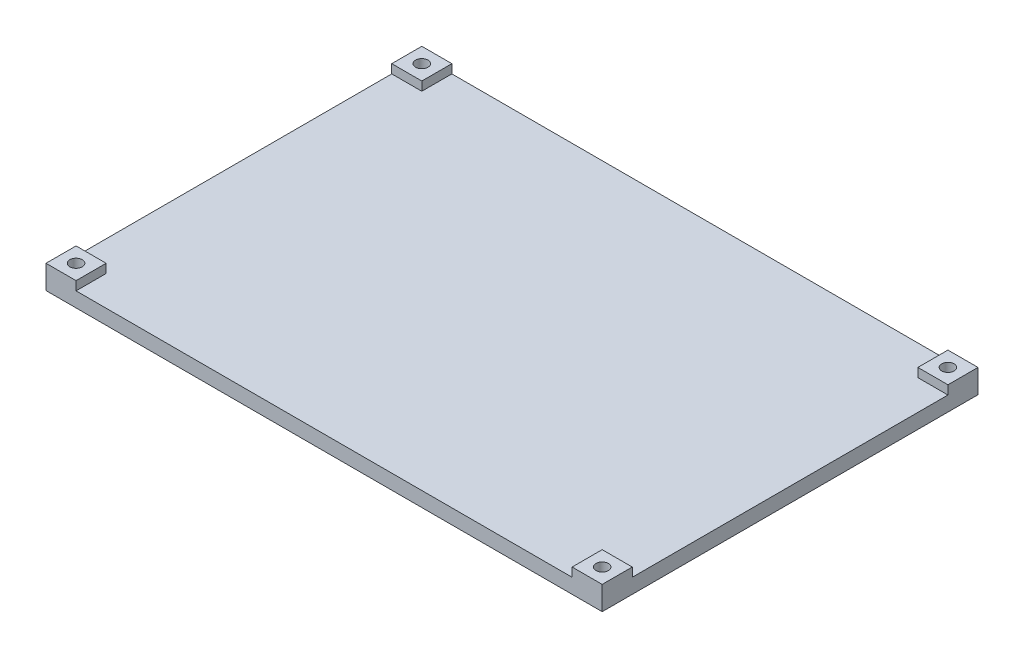
ISO-10303-21;
HEADER;
FILE_DESCRIPTION(('STEP AP214'),'2;1');
FILE_NAME('part.step','',(''),(''),'','','');
FILE_SCHEMA(('AUTOMOTIVE_DESIGN { 1 0 10303 214 1 1 1 1 }'));
ENDSEC;
DATA;
#1=APPLICATION_CONTEXT('core data for automotive mechanical design processes');
#2=APPLICATION_PROTOCOL_DEFINITION('international standard','automotive_design',2000,#1);
#3=PRODUCT_CONTEXT('',#1,'mechanical');
#4=PRODUCT('Part','Part','',(#3));
#5=PRODUCT_RELATED_PRODUCT_CATEGORY('part','',(#4));
#6=PRODUCT_DEFINITION_FORMATION('','',#4);
#7=PRODUCT_DEFINITION_CONTEXT('part definition',#1,'design');
#8=PRODUCT_DEFINITION('design','',#6,#7);
#9=PRODUCT_DEFINITION_SHAPE('','',#8);
#10=(LENGTH_UNIT() NAMED_UNIT(*) SI_UNIT(.MILLI.,.METRE.));
#11=(NAMED_UNIT(*) PLANE_ANGLE_UNIT() SI_UNIT($,.RADIAN.));
#12=(NAMED_UNIT(*) SI_UNIT($,.STERADIAN.) SOLID_ANGLE_UNIT());
#13=UNCERTAINTY_MEASURE_WITH_UNIT(LENGTH_MEASURE(1.E-05),#10,'distance_accuracy_value','');
#14=(GEOMETRIC_REPRESENTATION_CONTEXT(3) GLOBAL_UNCERTAINTY_ASSIGNED_CONTEXT((#13)) GLOBAL_UNIT_ASSIGNED_CONTEXT((#10,
#11,#12)) REPRESENTATION_CONTEXT('',''));
#15=CARTESIAN_POINT('',(0.,0.,0.));
#16=DIRECTION('',(0.,0.,1.));
#17=DIRECTION('',(1.,0.,0.));
#18=AXIS2_PLACEMENT_3D('',#15,#16,#17);
#19=CARTESIAN_POINT('',(0.,4.,0.));
#20=DIRECTION('',(0.,-1.,0.));
#21=DIRECTION('',(0.,0.,-1.));
#22=AXIS2_PLACEMENT_3D('',#19,#20,#21);
#23=PLANE('',#22);
#24=CARTESIAN_POINT('',(-44.45,4.,-29.21));
#25=DIRECTION('',(0.,1.,0.));
#26=DIRECTION('',(0.,0.,1.));
#27=AXIS2_PLACEMENT_3D('',#24,#25,#26);
#28=CIRCLE('',#27,1.05);
#29=CARTESIAN_POINT('',(-44.45,4.,-28.16));
#30=VERTEX_POINT('',#29);
#31=EDGE_CURVE('E332',#30,#30,#28,.T.);
#32=ORIENTED_EDGE('',*,*,#31,.F.);
#33=EDGE_LOOP('',(#32));
#34=FACE_BOUND('',#33,.T.);
#35=DIRECTION('',(0.,0.,-1.));
#36=VECTOR('',#35,1.);
#37=CARTESIAN_POINT('',(-41.91,4.,-31.75));
#38=LINE('',#37,#36);
#39=CARTESIAN_POINT('',(-41.91,4.,-26.67));
#40=VERTEX_POINT('',#39);
#41=CARTESIAN_POINT('',(-41.91,4.,-31.75));
#42=VERTEX_POINT('',#41);
#43=EDGE_CURVE('E294',#40,#42,#38,.T.);
#44=ORIENTED_EDGE('',*,*,#43,.T.);
#45=DIRECTION('',(1.,0.,0.));
#46=VECTOR('',#45,1.);
#47=CARTESIAN_POINT('',(-46.99,4.,-31.75));
#48=LINE('',#47,#46);
#49=CARTESIAN_POINT('',(-46.99,4.,-31.75));
#50=VERTEX_POINT('',#49);
#51=EDGE_CURVE('E341',#50,#42,#48,.T.);
#52=ORIENTED_EDGE('',*,*,#51,.F.);
#53=DIRECTION('',(0.,0.,-1.));
#54=VECTOR('',#53,1.);
#55=CARTESIAN_POINT('',(-46.99,4.,31.75));
#56=LINE('',#55,#54);
#57=CARTESIAN_POINT('',(-46.99,4.,-26.67));
#58=VERTEX_POINT('',#57);
#59=EDGE_CURVE('E148',#58,#50,#56,.T.);
#60=ORIENTED_EDGE('',*,*,#59,.F.);
#61=DIRECTION('',(1.,0.,0.));
#62=VECTOR('',#61,1.);
#63=CARTESIAN_POINT('',(-46.99,4.,-26.67));
#64=LINE('',#63,#62);
#65=EDGE_CURVE('E285',#58,#40,#64,.T.);
#66=ORIENTED_EDGE('',*,*,#65,.T.);
#67=EDGE_LOOP('',(#44,#52,#60,#66));
#68=FACE_BOUND('',#67,.T.);
#69=ADVANCED_FACE('F100',(#34,#68),#23,.F.);
#70=CARTESIAN_POINT('',(-44.45,4.,29.21));
#71=DIRECTION('',(0.,1.,0.));
#72=DIRECTION('',(0.,0.,1.));
#73=AXIS2_PLACEMENT_3D('',#70,#71,#72);
#74=CIRCLE('',#73,1.05);
#75=CARTESIAN_POINT('',(-44.45,4.,30.26));
#76=VERTEX_POINT('',#75);
#77=EDGE_CURVE('E314',#76,#76,#74,.T.);
#78=ORIENTED_EDGE('',*,*,#77,.F.);
#79=EDGE_LOOP('',(#78));
#80=FACE_BOUND('',#79,.T.);
#81=DIRECTION('',(-1.,0.,0.));
#82=VECTOR('',#81,1.);
#83=CARTESIAN_POINT('',(-46.99,4.,26.67));
#84=LINE('',#83,#82);
#85=CARTESIAN_POINT('',(-41.91,4.,26.67));
#86=VERTEX_POINT('',#85);
#87=CARTESIAN_POINT('',(-46.99,4.,26.67));
#88=VERTEX_POINT('',#87);
#89=EDGE_CURVE('E275',#86,#88,#84,.T.);
#90=ORIENTED_EDGE('',*,*,#89,.T.);
#91=CARTESIAN_POINT('',(-46.99,4.,31.75));
#92=VERTEX_POINT('',#91);
#93=EDGE_CURVE('E338',#92,#88,#56,.T.);
#94=ORIENTED_EDGE('',*,*,#93,.F.);
#95=DIRECTION('',(1.,0.,0.));
#96=VECTOR('',#95,1.);
#97=CARTESIAN_POINT('',(-46.99,4.,31.75));
#98=LINE('',#97,#96);
#99=CARTESIAN_POINT('',(-41.91,4.,31.75));
#100=VERTEX_POINT('',#99);
#101=EDGE_CURVE('E349',#92,#100,#98,.T.);
#102=ORIENTED_EDGE('',*,*,#101,.T.);
#103=DIRECTION('',(0.,0.,-1.));
#104=VECTOR('',#103,1.);
#105=CARTESIAN_POINT('',(-41.91,4.,26.67));
#106=LINE('',#105,#104);
#107=EDGE_CURVE('E266',#100,#86,#106,.T.);
#108=ORIENTED_EDGE('',*,*,#107,.T.);
#109=EDGE_LOOP('',(#90,#94,#102,#108));
#110=FACE_BOUND('',#109,.T.);
#111=ADVANCED_FACE('F396',(#80,#110),#23,.F.);
#112=CARTESIAN_POINT('',(44.45,4.,29.21));
#113=DIRECTION('',(0.,1.,0.));
#114=DIRECTION('',(0.,0.,1.));
#115=AXIS2_PLACEMENT_3D('',#112,#113,#114);
#116=CIRCLE('',#115,1.05);
#117=CARTESIAN_POINT('',(44.45,4.,30.26));
#118=VERTEX_POINT('',#117);
#119=EDGE_CURVE('E320',#118,#118,#116,.T.);
#120=ORIENTED_EDGE('',*,*,#119,.F.);
#121=EDGE_LOOP('',(#120));
#122=FACE_BOUND('',#121,.T.);
#123=DIRECTION('',(0.,0.,1.));
#124=VECTOR('',#123,1.);
#125=CARTESIAN_POINT('',(41.91,4.,31.75));
#126=LINE('',#125,#124);
#127=CARTESIAN_POINT('',(41.91,4.,26.67));
#128=VERTEX_POINT('',#127);
#129=CARTESIAN_POINT('',(41.91,4.,31.75));
#130=VERTEX_POINT('',#129);
#131=EDGE_CURVE('E256',#128,#130,#126,.T.);
#132=ORIENTED_EDGE('',*,*,#131,.T.);
#133=CARTESIAN_POINT('',(46.99,4.,31.75));
#134=VERTEX_POINT('',#133);
#135=EDGE_CURVE('E348',#130,#134,#98,.T.);
#136=ORIENTED_EDGE('',*,*,#135,.T.);
#137=DIRECTION('',(0.,0.,-1.));
#138=VECTOR('',#137,1.);
#139=CARTESIAN_POINT('',(46.99,4.,31.75));
#140=LINE('',#139,#138);
#141=CARTESIAN_POINT('',(46.99,4.,26.67));
#142=VERTEX_POINT('',#141);
#143=EDGE_CURVE('E345',#134,#142,#140,.T.);
#144=ORIENTED_EDGE('',*,*,#143,.T.);
#145=DIRECTION('',(-1.,0.,0.));
#146=VECTOR('',#145,1.);
#147=CARTESIAN_POINT('',(46.99,4.,26.67));
#148=LINE('',#147,#146);
#149=EDGE_CURVE('E249',#142,#128,#148,.T.);
#150=ORIENTED_EDGE('',*,*,#149,.T.);
#151=EDGE_LOOP('',(#132,#136,#144,#150));
#152=FACE_BOUND('',#151,.T.);
#153=ADVANCED_FACE('F385',(#122,#152),#23,.F.);
#154=CARTESIAN_POINT('',(44.45,4.,-29.21));
#155=DIRECTION('',(0.,1.,0.));
#156=DIRECTION('',(0.,0.,1.));
#157=AXIS2_PLACEMENT_3D('',#154,#155,#156);
#158=CIRCLE('',#157,1.05);
#159=CARTESIAN_POINT('',(44.45,4.,-28.16));
#160=VERTEX_POINT('',#159);
#161=EDGE_CURVE('E326',#160,#160,#158,.T.);
#162=ORIENTED_EDGE('',*,*,#161,.F.);
#163=EDGE_LOOP('',(#162));
#164=FACE_BOUND('',#163,.T.);
#165=DIRECTION('',(1.,0.,0.));
#166=VECTOR('',#165,1.);
#167=CARTESIAN_POINT('',(46.99,4.,-26.67));
#168=LINE('',#167,#166);
#169=CARTESIAN_POINT('',(41.91,4.,-26.67));
#170=VERTEX_POINT('',#169);
#171=CARTESIAN_POINT('',(46.99,4.,-26.67));
#172=VERTEX_POINT('',#171);
#173=EDGE_CURVE('E227',#170,#172,#168,.T.);
#174=ORIENTED_EDGE('',*,*,#173,.T.);
#175=CARTESIAN_POINT('',(46.99,4.,-31.75));
#176=VERTEX_POINT('',#175);
#177=EDGE_CURVE('E344',#172,#176,#140,.T.);
#178=ORIENTED_EDGE('',*,*,#177,.T.);
#179=CARTESIAN_POINT('',(41.91,4.,-31.75));
#180=VERTEX_POINT('',#179);
#181=EDGE_CURVE('E340',#180,#176,#48,.T.);
#182=ORIENTED_EDGE('',*,*,#181,.F.);
#183=DIRECTION('',(0.,0.,1.));
#184=VECTOR('',#183,1.);
#185=CARTESIAN_POINT('',(41.91,4.,-31.75));
#186=LINE('',#185,#184);
#187=EDGE_CURVE('E115',#180,#170,#186,.T.);
#188=ORIENTED_EDGE('',*,*,#187,.T.);
#189=EDGE_LOOP('',(#174,#178,#182,#188));
#190=FACE_BOUND('',#189,.T.);
#191=ADVANCED_FACE('F416',(#164,#190),#23,.F.);
#192=CARTESIAN_POINT('',(-46.99,4.,31.75));
#193=DIRECTION('',(-1.,0.,0.));
#194=DIRECTION('',(0.,0.,1.));
#195=AXIS2_PLACEMENT_3D('',#192,#193,#194);
#196=PLANE('',#195);
#197=DIRECTION('',(0.,-1.,0.));
#198=VECTOR('',#197,1.);
#199=CARTESIAN_POINT('',(-46.99,4.,-31.75));
#200=LINE('',#199,#198);
#201=CARTESIAN_POINT('',(-46.99,0.,-31.75));
#202=VERTEX_POINT('',#201);
#203=EDGE_CURVE('E352',#50,#202,#200,.T.);
#204=ORIENTED_EDGE('',*,*,#203,.T.);
#205=DIRECTION('',(0.,0.,-1.));
#206=VECTOR('',#205,1.);
#207=CARTESIAN_POINT('',(-46.99,0.,31.75));
#208=LINE('',#207,#206);
#209=CARTESIAN_POINT('',(-46.99,0.,31.75));
#210=VERTEX_POINT('',#209);
#211=EDGE_CURVE('E335',#210,#202,#208,.T.);
#212=ORIENTED_EDGE('',*,*,#211,.F.);
#213=DIRECTION('',(0.,-1.,0.));
#214=VECTOR('',#213,1.);
#215=CARTESIAN_POINT('',(-46.99,4.,31.75));
#216=LINE('',#215,#214);
#217=EDGE_CURVE('E108',#92,#210,#216,.T.);
#218=ORIENTED_EDGE('',*,*,#217,.F.);
#219=ORIENTED_EDGE('',*,*,#93,.T.);
#220=DIRECTION('',(0.,1.,0.));
#221=VECTOR('',#220,1.);
#222=CARTESIAN_POINT('',(-46.99,2.5,26.67));
#223=LINE('',#222,#221);
#224=CARTESIAN_POINT('',(-46.99,2.5,26.67));
#225=VERTEX_POINT('',#224);
#226=EDGE_CURVE('E283',#225,#88,#223,.T.);
#227=ORIENTED_EDGE('',*,*,#226,.F.);
#228=DIRECTION('',(0.,0.,-1.));
#229=VECTOR('',#228,1.);
#230=CARTESIAN_POINT('',(-46.99,2.5,31.75));
#231=LINE('',#230,#229);
#232=CARTESIAN_POINT('',(-46.99,2.5,-26.67));
#233=VERTEX_POINT('',#232);
#234=EDGE_CURVE('E310',#225,#233,#231,.T.);
#235=ORIENTED_EDGE('',*,*,#234,.T.);
#236=DIRECTION('',(0.,1.,0.));
#237=VECTOR('',#236,1.);
#238=CARTESIAN_POINT('',(-46.99,2.5,-26.67));
#239=LINE('',#238,#237);
#240=EDGE_CURVE('E297',#233,#58,#239,.T.);
#241=ORIENTED_EDGE('',*,*,#240,.T.);
#242=ORIENTED_EDGE('',*,*,#59,.T.);
#243=EDGE_LOOP('',(#204,#212,#218,#219,#227,#235,#241,#242));
#244=FACE_BOUND('',#243,.T.);
#245=ADVANCED_FACE('F102',(#244),#196,.T.);
#246=CARTESIAN_POINT('',(0.,0.,0.));
#247=DIRECTION('',(0.,-1.,0.));
#248=DIRECTION('',(0.,0.,-1.));
#249=AXIS2_PLACEMENT_3D('',#246,#247,#248);
#250=PLANE('',#249);
#251=CARTESIAN_POINT('',(36.99,0.,21.75));
#252=DIRECTION('',(0.,-1.,0.));
#253=DIRECTION('',(0.,0.,-1.));
#254=AXIS2_PLACEMENT_3D('',#251,#252,#253);
#255=CIRCLE('',#254,2.6);
#256=CARTESIAN_POINT('',(36.99,0.,19.15));
#257=VERTEX_POINT('',#256);
#258=EDGE_CURVE('E798',#257,#257,#255,.T.);
#259=ORIENTED_EDGE('',*,*,#258,.F.);
#260=EDGE_LOOP('',(#259));
#261=FACE_BOUND('',#260,.T.);
#262=CARTESIAN_POINT('',(0.,0.,-21.75));
#263=DIRECTION('',(0.,-1.,0.));
#264=DIRECTION('',(0.,0.,-1.));
#265=AXIS2_PLACEMENT_3D('',#262,#263,#264);
#266=CIRCLE('',#265,2.6);
#267=CARTESIAN_POINT('',(0.,0.,-24.35));
#268=VERTEX_POINT('',#267);
#269=EDGE_CURVE('E820',#268,#268,#266,.T.);
#270=ORIENTED_EDGE('',*,*,#269,.F.);
#271=EDGE_LOOP('',(#270));
#272=FACE_BOUND('',#271,.T.);
#273=CARTESIAN_POINT('',(0.,0.,21.75));
#274=DIRECTION('',(0.,-1.,0.));
#275=DIRECTION('',(0.,0.,-1.));
#276=AXIS2_PLACEMENT_3D('',#273,#274,#275);
#277=CIRCLE('',#276,2.6);
#278=CARTESIAN_POINT('',(0.,0.,19.15));
#279=VERTEX_POINT('',#278);
#280=EDGE_CURVE('E815',#279,#279,#277,.T.);
#281=ORIENTED_EDGE('',*,*,#280,.F.);
#282=EDGE_LOOP('',(#281));
#283=FACE_BOUND('',#282,.T.);
#284=CARTESIAN_POINT('',(-36.99,0.,-21.75));
#285=DIRECTION('',(0.,-1.,0.));
#286=DIRECTION('',(0.,0.,-1.));
#287=AXIS2_PLACEMENT_3D('',#284,#285,#286);
#288=CIRCLE('',#287,2.6);
#289=CARTESIAN_POINT('',(-36.99,0.,-24.35));
#290=VERTEX_POINT('',#289);
#291=EDGE_CURVE('E809',#290,#290,#288,.T.);
#292=ORIENTED_EDGE('',*,*,#291,.F.);
#293=EDGE_LOOP('',(#292));
#294=FACE_BOUND('',#293,.T.);
#295=CARTESIAN_POINT('',(36.99,0.,-21.75));
#296=DIRECTION('',(0.,-1.,0.));
#297=DIRECTION('',(0.,0.,-1.));
#298=AXIS2_PLACEMENT_3D('',#295,#296,#297);
#299=CIRCLE('',#298,2.6);
#300=CARTESIAN_POINT('',(36.99,0.,-24.35));
#301=VERTEX_POINT('',#300);
#302=EDGE_CURVE('E799',#301,#301,#299,.T.);
#303=ORIENTED_EDGE('',*,*,#302,.F.);
#304=EDGE_LOOP('',(#303));
#305=FACE_BOUND('',#304,.T.);
#306=CARTESIAN_POINT('',(-36.99,0.,21.75));
#307=DIRECTION('',(0.,-1.,0.));
#308=DIRECTION('',(0.,0.,-1.));
#309=AXIS2_PLACEMENT_3D('',#306,#307,#308);
#310=CIRCLE('',#309,2.6);
#311=CARTESIAN_POINT('',(-36.99,0.,19.15));
#312=VERTEX_POINT('',#311);
#313=EDGE_CURVE('E244',#312,#312,#310,.T.);
#314=ORIENTED_EDGE('',*,*,#313,.F.);
#315=EDGE_LOOP('',(#314));
#316=FACE_BOUND('',#315,.T.);
#317=CARTESIAN_POINT('',(44.45,0.,29.21));
#318=DIRECTION('',(0.,1.,0.));
#319=DIRECTION('',(0.,0.,1.));
#320=AXIS2_PLACEMENT_3D('',#317,#318,#319);
#321=CIRCLE('',#320,1.05);
#322=CARTESIAN_POINT('',(44.45,0.,30.26));
#323=VERTEX_POINT('',#322);
#324=EDGE_CURVE('E317',#323,#323,#321,.T.);
#325=ORIENTED_EDGE('',*,*,#324,.T.);
#326=EDGE_LOOP('',(#325));
#327=FACE_BOUND('',#326,.T.);
#328=CARTESIAN_POINT('',(-44.45,0.,-29.21));
#329=DIRECTION('',(0.,1.,0.));
#330=DIRECTION('',(0.,0.,1.));
#331=AXIS2_PLACEMENT_3D('',#328,#329,#330);
#332=CIRCLE('',#331,1.05);
#333=CARTESIAN_POINT('',(-44.45,0.,-28.16));
#334=VERTEX_POINT('',#333);
#335=EDGE_CURVE('E329',#334,#334,#332,.T.);
#336=ORIENTED_EDGE('',*,*,#335,.T.);
#337=EDGE_LOOP('',(#336));
#338=FACE_BOUND('',#337,.T.);
#339=ORIENTED_EDGE('',*,*,#211,.T.);
#340=DIRECTION('',(1.,0.,0.));
#341=VECTOR('',#340,1.);
#342=CARTESIAN_POINT('',(-46.99,0.,-31.75));
#343=LINE('',#342,#341);
#344=CARTESIAN_POINT('',(46.99,0.,-31.75));
#345=VERTEX_POINT('',#344);
#346=EDGE_CURVE('E355',#202,#345,#343,.T.);
#347=ORIENTED_EDGE('',*,*,#346,.T.);
#348=DIRECTION('',(0.,0.,-1.));
#349=VECTOR('',#348,1.);
#350=CARTESIAN_POINT('',(46.99,0.,31.75));
#351=LINE('',#350,#349);
#352=CARTESIAN_POINT('',(46.99,0.,31.75));
#353=VERTEX_POINT('',#352);
#354=EDGE_CURVE('E358',#353,#345,#351,.T.);
#355=ORIENTED_EDGE('',*,*,#354,.F.);
#356=DIRECTION('',(1.,0.,0.));
#357=VECTOR('',#356,1.);
#358=CARTESIAN_POINT('',(-46.99,0.,31.75));
#359=LINE('',#358,#357);
#360=EDGE_CURVE('E361',#210,#353,#359,.T.);
#361=ORIENTED_EDGE('',*,*,#360,.F.);
#362=EDGE_LOOP('',(#339,#347,#355,#361));
#363=FACE_BOUND('',#362,.T.);
#364=CARTESIAN_POINT('',(44.45,0.,-29.21));
#365=DIRECTION('',(0.,1.,0.));
#366=DIRECTION('',(0.,0.,1.));
#367=AXIS2_PLACEMENT_3D('',#364,#365,#366);
#368=CIRCLE('',#367,1.05);
#369=CARTESIAN_POINT('',(44.45,0.,-28.16));
#370=VERTEX_POINT('',#369);
#371=EDGE_CURVE('E323',#370,#370,#368,.T.);
#372=ORIENTED_EDGE('',*,*,#371,.T.);
#373=EDGE_LOOP('',(#372));
#374=FACE_BOUND('',#373,.T.);
#375=CARTESIAN_POINT('',(-44.45,0.,29.21));
#376=DIRECTION('',(0.,1.,0.));
#377=DIRECTION('',(0.,0.,1.));
#378=AXIS2_PLACEMENT_3D('',#375,#376,#377);
#379=CIRCLE('',#378,1.05);
#380=CARTESIAN_POINT('',(-44.45,0.,30.26));
#381=VERTEX_POINT('',#380);
#382=EDGE_CURVE('E313',#381,#381,#379,.T.);
#383=ORIENTED_EDGE('',*,*,#382,.T.);
#384=EDGE_LOOP('',(#383));
#385=FACE_BOUND('',#384,.T.);
#386=ADVANCED_FACE('F375',(#261,#272,#283,#294,#305,#316,#327,#338,#363,#374,#385),#250,.T.);
#387=CARTESIAN_POINT('',(-46.99,4.,31.75));
#388=DIRECTION('',(0.,0.,-1.));
#389=DIRECTION('',(-1.,0.,0.));
#390=AXIS2_PLACEMENT_3D('',#387,#388,#389);
#391=PLANE('',#390);
#392=DIRECTION('',(0.,1.,0.));
#393=VECTOR('',#392,1.);
#394=CARTESIAN_POINT('',(41.91,2.5,31.75));
#395=LINE('',#394,#393);
#396=CARTESIAN_POINT('',(41.91,2.5,31.75));
#397=VERTEX_POINT('',#396);
#398=EDGE_CURVE('E264',#397,#130,#395,.T.);
#399=ORIENTED_EDGE('',*,*,#398,.F.);
#400=DIRECTION('',(1.,0.,0.));
#401=VECTOR('',#400,1.);
#402=CARTESIAN_POINT('',(-46.99,2.5,31.75));
#403=LINE('',#402,#401);
#404=CARTESIAN_POINT('',(-41.91,2.5,31.75));
#405=VERTEX_POINT('',#404);
#406=EDGE_CURVE('E308',#405,#397,#403,.T.);
#407=ORIENTED_EDGE('',*,*,#406,.F.);
#408=DIRECTION('',(0.,1.,0.));
#409=VECTOR('',#408,1.);
#410=CARTESIAN_POINT('',(-41.91,2.5,31.75));
#411=LINE('',#410,#409);
#412=EDGE_CURVE('E278',#405,#100,#411,.T.);
#413=ORIENTED_EDGE('',*,*,#412,.T.);
#414=ORIENTED_EDGE('',*,*,#101,.F.);
#415=ORIENTED_EDGE('',*,*,#217,.T.);
#416=ORIENTED_EDGE('',*,*,#360,.T.);
#417=DIRECTION('',(0.,-1.,0.));
#418=VECTOR('',#417,1.);
#419=CARTESIAN_POINT('',(46.99,4.,31.75));
#420=LINE('',#419,#418);
#421=EDGE_CURVE('E364',#134,#353,#420,.T.);
#422=ORIENTED_EDGE('',*,*,#421,.F.);
#423=ORIENTED_EDGE('',*,*,#135,.F.);
#424=EDGE_LOOP('',(#399,#407,#413,#414,#415,#416,#422,#423));
#425=FACE_BOUND('',#424,.T.);
#426=ADVANCED_FACE('F379',(#425),#391,.F.);
#427=CARTESIAN_POINT('',(46.99,4.,31.75));
#428=DIRECTION('',(-1.,0.,0.));
#429=DIRECTION('',(0.,0.,1.));
#430=AXIS2_PLACEMENT_3D('',#427,#428,#429);
#431=PLANE('',#430);
#432=DIRECTION('',(0.,1.,0.));
#433=VECTOR('',#432,1.);
#434=CARTESIAN_POINT('',(46.99,2.5,-26.67));
#435=LINE('',#434,#433);
#436=CARTESIAN_POINT('',(46.99,2.5,-26.67));
#437=VERTEX_POINT('',#436);
#438=EDGE_CURVE('E229',#437,#172,#435,.T.);
#439=ORIENTED_EDGE('',*,*,#438,.F.);
#440=DIRECTION('',(0.,0.,-1.));
#441=VECTOR('',#440,1.);
#442=CARTESIAN_POINT('',(46.99,2.5,31.75));
#443=LINE('',#442,#441);
#444=CARTESIAN_POINT('',(46.99,2.5,26.67));
#445=VERTEX_POINT('',#444);
#446=EDGE_CURVE('E238',#445,#437,#443,.T.);
#447=ORIENTED_EDGE('',*,*,#446,.F.);
#448=DIRECTION('',(0.,1.,0.));
#449=VECTOR('',#448,1.);
#450=CARTESIAN_POINT('',(46.99,2.5,26.67));
#451=LINE('',#450,#449);
#452=EDGE_CURVE('E259',#445,#142,#451,.T.);
#453=ORIENTED_EDGE('',*,*,#452,.T.);
#454=ORIENTED_EDGE('',*,*,#143,.F.);
#455=ORIENTED_EDGE('',*,*,#421,.T.);
#456=ORIENTED_EDGE('',*,*,#354,.T.);
#457=DIRECTION('',(0.,-1.,0.));
#458=VECTOR('',#457,1.);
#459=CARTESIAN_POINT('',(46.99,4.,-31.75));
#460=LINE('',#459,#458);
#461=EDGE_CURVE('E366',#176,#345,#460,.T.);
#462=ORIENTED_EDGE('',*,*,#461,.F.);
#463=ORIENTED_EDGE('',*,*,#177,.F.);
#464=EDGE_LOOP('',(#439,#447,#453,#454,#455,#456,#462,#463));
#465=FACE_BOUND('',#464,.T.);
#466=ADVANCED_FACE('F383',(#465),#431,.F.);
#467=CARTESIAN_POINT('',(-46.99,4.,-31.75));
#468=DIRECTION('',(0.,0.,-1.));
#469=DIRECTION('',(-1.,0.,0.));
#470=AXIS2_PLACEMENT_3D('',#467,#468,#469);
#471=PLANE('',#470);
#472=ORIENTED_EDGE('',*,*,#461,.T.);
#473=ORIENTED_EDGE('',*,*,#346,.F.);
#474=ORIENTED_EDGE('',*,*,#203,.F.);
#475=ORIENTED_EDGE('',*,*,#51,.T.);
#476=DIRECTION('',(0.,1.,0.));
#477=VECTOR('',#476,1.);
#478=CARTESIAN_POINT('',(-41.91,2.5,-31.75));
#479=LINE('',#478,#477);
#480=CARTESIAN_POINT('',(-41.91,2.5,-31.75));
#481=VERTEX_POINT('',#480);
#482=EDGE_CURVE('E302',#481,#42,#479,.T.);
#483=ORIENTED_EDGE('',*,*,#482,.F.);
#484=DIRECTION('',(1.,0.,0.));
#485=VECTOR('',#484,1.);
#486=CARTESIAN_POINT('',(-46.99,2.5,-31.75));
#487=LINE('',#486,#485);
#488=CARTESIAN_POINT('',(41.91,2.5,-31.75));
#489=VERTEX_POINT('',#488);
#490=EDGE_CURVE('E13',#481,#489,#487,.T.);
#491=ORIENTED_EDGE('',*,*,#490,.T.);
#492=DIRECTION('',(0.,1.,0.));
#493=VECTOR('',#492,1.);
#494=CARTESIAN_POINT('',(41.91,2.5,-31.75));
#495=LINE('',#494,#493);
#496=EDGE_CURVE('E230',#489,#180,#495,.T.);
#497=ORIENTED_EDGE('',*,*,#496,.T.);
#498=ORIENTED_EDGE('',*,*,#181,.T.);
#499=EDGE_LOOP('',(#472,#473,#474,#475,#483,#491,#497,#498));
#500=FACE_BOUND('',#499,.T.);
#501=ADVANCED_FACE('F370',(#500),#471,.T.);
#502=CARTESIAN_POINT('',(-44.45,4.,-29.21));
#503=DIRECTION('',(0.,-1.,0.));
#504=DIRECTION('',(0.,0.,-1.));
#505=AXIS2_PLACEMENT_3D('',#502,#503,#504);
#506=CYLINDRICAL_SURFACE('',#505,1.05);
#507=ORIENTED_EDGE('',*,*,#31,.T.);
#508=EDGE_LOOP('',(#507));
#509=FACE_BOUND('',#508,.T.);
#510=ORIENTED_EDGE('',*,*,#335,.F.);
#511=EDGE_LOOP('',(#510));
#512=FACE_BOUND('',#511,.T.);
#513=ADVANCED_FACE('F458',(#509,#512),#506,.F.);
#514=CARTESIAN_POINT('',(44.45,4.,-29.21));
#515=DIRECTION('',(0.,-1.,0.));
#516=DIRECTION('',(0.,0.,-1.));
#517=AXIS2_PLACEMENT_3D('',#514,#515,#516);
#518=CYLINDRICAL_SURFACE('',#517,1.05);
#519=ORIENTED_EDGE('',*,*,#161,.T.);
#520=EDGE_LOOP('',(#519));
#521=FACE_BOUND('',#520,.T.);
#522=ORIENTED_EDGE('',*,*,#371,.F.);
#523=EDGE_LOOP('',(#522));
#524=FACE_BOUND('',#523,.T.);
#525=ADVANCED_FACE('F455',(#521,#524),#518,.F.);
#526=CARTESIAN_POINT('',(44.45,4.,29.21));
#527=DIRECTION('',(0.,-1.,0.));
#528=DIRECTION('',(0.,0.,-1.));
#529=AXIS2_PLACEMENT_3D('',#526,#527,#528);
#530=CYLINDRICAL_SURFACE('',#529,1.05);
#531=ORIENTED_EDGE('',*,*,#119,.T.);
#532=EDGE_LOOP('',(#531));
#533=FACE_BOUND('',#532,.T.);
#534=ORIENTED_EDGE('',*,*,#324,.F.);
#535=EDGE_LOOP('',(#534));
#536=FACE_BOUND('',#535,.T.);
#537=ADVANCED_FACE('F451',(#533,#536),#530,.F.);
#538=CARTESIAN_POINT('',(-44.45,4.,29.21));
#539=DIRECTION('',(0.,-1.,0.));
#540=DIRECTION('',(0.,0.,-1.));
#541=AXIS2_PLACEMENT_3D('',#538,#539,#540);
#542=CYLINDRICAL_SURFACE('',#541,1.05);
#543=ORIENTED_EDGE('',*,*,#77,.T.);
#544=EDGE_LOOP('',(#543));
#545=FACE_BOUND('',#544,.T.);
#546=ORIENTED_EDGE('',*,*,#382,.F.);
#547=EDGE_LOOP('',(#546));
#548=FACE_BOUND('',#547,.T.);
#549=ADVANCED_FACE('F446',(#545,#548),#542,.F.);
#550=CARTESIAN_POINT('',(0.,2.5,0.));
#551=DIRECTION('',(0.,1.,0.));
#552=DIRECTION('',(0.,0.,1.));
#553=AXIS2_PLACEMENT_3D('',#550,#551,#552);
#554=PLANE('',#553);
#555=DIRECTION('',(-1.,0.,0.));
#556=VECTOR('',#555,1.);
#557=CARTESIAN_POINT('',(-46.99,2.5,26.67));
#558=LINE('',#557,#556);
#559=CARTESIAN_POINT('',(-41.91,2.5,26.67));
#560=VERTEX_POINT('',#559);
#561=EDGE_CURVE('E274',#560,#225,#558,.T.);
#562=ORIENTED_EDGE('',*,*,#561,.F.);
#563=DIRECTION('',(0.,0.,-1.));
#564=VECTOR('',#563,1.);
#565=CARTESIAN_POINT('',(-41.91,2.5,26.67));
#566=LINE('',#565,#564);
#567=EDGE_CURVE('E271',#405,#560,#566,.T.);
#568=ORIENTED_EDGE('',*,*,#567,.F.);
#569=ORIENTED_EDGE('',*,*,#406,.T.);
#570=DIRECTION('',(0.,0.,1.));
#571=VECTOR('',#570,1.);
#572=CARTESIAN_POINT('',(41.91,2.5,31.75));
#573=LINE('',#572,#571);
#574=CARTESIAN_POINT('',(41.91,2.5,26.67));
#575=VERTEX_POINT('',#574);
#576=EDGE_CURVE('E255',#575,#397,#573,.T.);
#577=ORIENTED_EDGE('',*,*,#576,.F.);
#578=DIRECTION('',(-1.,0.,0.));
#579=VECTOR('',#578,1.);
#580=CARTESIAN_POINT('',(46.99,2.5,26.67));
#581=LINE('',#580,#579);
#582=EDGE_CURVE('E252',#445,#575,#581,.T.);
#583=ORIENTED_EDGE('',*,*,#582,.F.);
#584=ORIENTED_EDGE('',*,*,#446,.T.);
#585=DIRECTION('',(1.,0.,0.));
#586=VECTOR('',#585,1.);
#587=CARTESIAN_POINT('',(46.99,2.5,-26.67));
#588=LINE('',#587,#586);
#589=CARTESIAN_POINT('',(41.91,2.5,-26.67));
#590=VERTEX_POINT('',#589);
#591=EDGE_CURVE('E224',#590,#437,#588,.T.);
#592=ORIENTED_EDGE('',*,*,#591,.F.);
#593=DIRECTION('',(0.,0.,1.));
#594=VECTOR('',#593,1.);
#595=CARTESIAN_POINT('',(41.91,2.5,-31.75));
#596=LINE('',#595,#594);
#597=EDGE_CURVE('E235',#489,#590,#596,.T.);
#598=ORIENTED_EDGE('',*,*,#597,.F.);
#599=ORIENTED_EDGE('',*,*,#490,.F.);
#600=DIRECTION('',(0.,0.,-1.));
#601=VECTOR('',#600,1.);
#602=CARTESIAN_POINT('',(-41.91,2.5,-31.75));
#603=LINE('',#602,#601);
#604=CARTESIAN_POINT('',(-41.91,2.5,-26.67));
#605=VERTEX_POINT('',#604);
#606=EDGE_CURVE('E293',#605,#481,#603,.T.);
#607=ORIENTED_EDGE('',*,*,#606,.F.);
#608=DIRECTION('',(1.,0.,0.));
#609=VECTOR('',#608,1.);
#610=CARTESIAN_POINT('',(-46.99,2.5,-26.67));
#611=LINE('',#610,#609);
#612=EDGE_CURVE('E290',#233,#605,#611,.T.);
#613=ORIENTED_EDGE('',*,*,#612,.F.);
#614=ORIENTED_EDGE('',*,*,#234,.F.);
#615=EDGE_LOOP('',(#562,#568,#569,#577,#583,#584,#592,#598,#599,#607,#613,#614));
#616=FACE_BOUND('',#615,.T.);
#617=ADVANCED_FACE('F234',(#616),#554,.T.);
#618=CARTESIAN_POINT('',(-41.91,2.5,-31.75));
#619=DIRECTION('',(1.,0.,0.));
#620=DIRECTION('',(0.,0.,-1.));
#621=AXIS2_PLACEMENT_3D('',#618,#619,#620);
#622=PLANE('',#621);
#623=ORIENTED_EDGE('',*,*,#43,.F.);
#624=DIRECTION('',(0.,1.,0.));
#625=VECTOR('',#624,1.);
#626=CARTESIAN_POINT('',(-41.91,2.5,-26.67));
#627=LINE('',#626,#625);
#628=EDGE_CURVE('E304',#605,#40,#627,.T.);
#629=ORIENTED_EDGE('',*,*,#628,.F.);
#630=ORIENTED_EDGE('',*,*,#606,.T.);
#631=ORIENTED_EDGE('',*,*,#482,.T.);
#632=EDGE_LOOP('',(#623,#629,#630,#631));
#633=FACE_BOUND('',#632,.T.);
#634=ADVANCED_FACE('F409',(#633),#622,.T.);
#635=CARTESIAN_POINT('',(-46.99,2.5,-26.67));
#636=DIRECTION('',(0.,0.,1.));
#637=DIRECTION('',(1.,0.,0.));
#638=AXIS2_PLACEMENT_3D('',#635,#636,#637);
#639=PLANE('',#638);
#640=ORIENTED_EDGE('',*,*,#65,.F.);
#641=ORIENTED_EDGE('',*,*,#240,.F.);
#642=ORIENTED_EDGE('',*,*,#612,.T.);
#643=ORIENTED_EDGE('',*,*,#628,.T.);
#644=EDGE_LOOP('',(#640,#641,#642,#643));
#645=FACE_BOUND('',#644,.T.);
#646=ADVANCED_FACE('F402',(#645),#639,.T.);
#647=CARTESIAN_POINT('',(-46.99,2.5,26.67));
#648=DIRECTION('',(0.,0.,-1.));
#649=DIRECTION('',(-1.,0.,0.));
#650=AXIS2_PLACEMENT_3D('',#647,#648,#649);
#651=PLANE('',#650);
#652=ORIENTED_EDGE('',*,*,#89,.F.);
#653=DIRECTION('',(0.,1.,0.));
#654=VECTOR('',#653,1.);
#655=CARTESIAN_POINT('',(-41.91,2.5,26.67));
#656=LINE('',#655,#654);
#657=EDGE_CURVE('E286',#560,#86,#656,.T.);
#658=ORIENTED_EDGE('',*,*,#657,.F.);
#659=ORIENTED_EDGE('',*,*,#561,.T.);
#660=ORIENTED_EDGE('',*,*,#226,.T.);
#661=EDGE_LOOP('',(#652,#658,#659,#660));
#662=FACE_BOUND('',#661,.T.);
#663=ADVANCED_FACE('F400',(#662),#651,.T.);
#664=CARTESIAN_POINT('',(-41.91,2.5,26.67));
#665=DIRECTION('',(1.,0.,0.));
#666=DIRECTION('',(0.,0.,-1.));
#667=AXIS2_PLACEMENT_3D('',#664,#665,#666);
#668=PLANE('',#667);
#669=ORIENTED_EDGE('',*,*,#107,.F.);
#670=ORIENTED_EDGE('',*,*,#412,.F.);
#671=ORIENTED_EDGE('',*,*,#567,.T.);
#672=ORIENTED_EDGE('',*,*,#657,.T.);
#673=EDGE_LOOP('',(#669,#670,#671,#672));
#674=FACE_BOUND('',#673,.T.);
#675=ADVANCED_FACE('F393',(#674),#668,.T.);
#676=CARTESIAN_POINT('',(41.91,2.5,31.75));
#677=DIRECTION('',(-1.,0.,0.));
#678=DIRECTION('',(0.,0.,1.));
#679=AXIS2_PLACEMENT_3D('',#676,#677,#678);
#680=PLANE('',#679);
#681=ORIENTED_EDGE('',*,*,#131,.F.);
#682=DIRECTION('',(0.,1.,0.));
#683=VECTOR('',#682,1.);
#684=CARTESIAN_POINT('',(41.91,2.5,26.67));
#685=LINE('',#684,#683);
#686=EDGE_CURVE('E267',#575,#128,#685,.T.);
#687=ORIENTED_EDGE('',*,*,#686,.F.);
#688=ORIENTED_EDGE('',*,*,#576,.T.);
#689=ORIENTED_EDGE('',*,*,#398,.T.);
#690=EDGE_LOOP('',(#681,#687,#688,#689));
#691=FACE_BOUND('',#690,.T.);
#692=ADVANCED_FACE('F389',(#691),#680,.T.);
#693=CARTESIAN_POINT('',(46.99,2.5,26.67));
#694=DIRECTION('',(0.,0.,-1.));
#695=DIRECTION('',(-1.,0.,0.));
#696=AXIS2_PLACEMENT_3D('',#693,#694,#695);
#697=PLANE('',#696);
#698=ORIENTED_EDGE('',*,*,#149,.F.);
#699=ORIENTED_EDGE('',*,*,#452,.F.);
#700=ORIENTED_EDGE('',*,*,#582,.T.);
#701=ORIENTED_EDGE('',*,*,#686,.T.);
#702=EDGE_LOOP('',(#698,#699,#700,#701));
#703=FACE_BOUND('',#702,.T.);
#704=ADVANCED_FACE('F529',(#703),#697,.T.);
#705=CARTESIAN_POINT('',(46.99,2.5,-26.67));
#706=DIRECTION('',(0.,0.,1.));
#707=DIRECTION('',(1.,0.,0.));
#708=AXIS2_PLACEMENT_3D('',#705,#706,#707);
#709=PLANE('',#708);
#710=ORIENTED_EDGE('',*,*,#173,.F.);
#711=DIRECTION('',(0.,1.,0.));
#712=VECTOR('',#711,1.);
#713=CARTESIAN_POINT('',(41.91,2.5,-26.67));
#714=LINE('',#713,#712);
#715=EDGE_CURVE('E221',#590,#170,#714,.T.);
#716=ORIENTED_EDGE('',*,*,#715,.F.);
#717=ORIENTED_EDGE('',*,*,#591,.T.);
#718=ORIENTED_EDGE('',*,*,#438,.T.);
#719=EDGE_LOOP('',(#710,#716,#717,#718));
#720=FACE_BOUND('',#719,.T.);
#721=ADVANCED_FACE('F223',(#720),#709,.T.);
#722=CARTESIAN_POINT('',(41.91,2.5,-31.75));
#723=DIRECTION('',(-1.,0.,0.));
#724=DIRECTION('',(0.,0.,1.));
#725=AXIS2_PLACEMENT_3D('',#722,#723,#724);
#726=PLANE('',#725);
#727=ORIENTED_EDGE('',*,*,#187,.F.);
#728=ORIENTED_EDGE('',*,*,#496,.F.);
#729=ORIENTED_EDGE('',*,*,#597,.T.);
#730=ORIENTED_EDGE('',*,*,#715,.T.);
#731=EDGE_LOOP('',(#727,#728,#729,#730));
#732=FACE_BOUND('',#731,.T.);
#733=ADVANCED_FACE('F240',(#732),#726,.T.);
#734=CARTESIAN_POINT('',(-36.99,0.8,21.75));
#735=DIRECTION('',(0.,-1.,0.));
#736=DIRECTION('',(0.,0.,-1.));
#737=AXIS2_PLACEMENT_3D('',#734,#735,#736);
#738=CYLINDRICAL_SURFACE('',#737,2.6);
#739=CARTESIAN_POINT('',(-36.99,0.8,21.75));
#740=DIRECTION('',(0.,-1.,0.));
#741=DIRECTION('',(0.,0.,-1.));
#742=AXIS2_PLACEMENT_3D('',#739,#740,#741);
#743=CIRCLE('',#742,2.6);
#744=CARTESIAN_POINT('',(-36.99,0.8,19.15));
#745=VERTEX_POINT('',#744);
#746=EDGE_CURVE('E247',#745,#745,#743,.T.);
#747=ORIENTED_EDGE('',*,*,#746,.F.);
#748=EDGE_LOOP('',(#747));
#749=FACE_BOUND('',#748,.T.);
#750=ORIENTED_EDGE('',*,*,#313,.T.);
#751=EDGE_LOOP('',(#750));
#752=FACE_BOUND('',#751,.T.);
#753=ADVANCED_FACE('F556',(#749,#752),#738,.F.);
#754=CARTESIAN_POINT('',(-36.99,0.8,21.75));
#755=DIRECTION('',(0.,-1.,0.));
#756=DIRECTION('',(0.,0.,-1.));
#757=AXIS2_PLACEMENT_3D('',#754,#755,#756);
#758=PLANE('',#757);
#759=ORIENTED_EDGE('',*,*,#746,.T.);
#760=EDGE_LOOP('',(#759));
#761=FACE_BOUND('',#760,.T.);
#762=ADVANCED_FACE('F573',(#761),#758,.T.);
#763=CARTESIAN_POINT('',(36.99,0.8,-21.75));
#764=DIRECTION('',(0.,-1.,0.));
#765=DIRECTION('',(0.,0.,-1.));
#766=AXIS2_PLACEMENT_3D('',#763,#764,#765);
#767=CYLINDRICAL_SURFACE('',#766,2.6);
#768=CARTESIAN_POINT('',(36.99,0.8,-21.75));
#769=DIRECTION('',(0.,-1.,0.));
#770=DIRECTION('',(0.,0.,-1.));
#771=AXIS2_PLACEMENT_3D('',#768,#769,#770);
#772=CIRCLE('',#771,2.6);
#773=CARTESIAN_POINT('',(36.99,0.8,-24.35));
#774=VERTEX_POINT('',#773);
#775=EDGE_CURVE('E805',#774,#774,#772,.T.);
#776=ORIENTED_EDGE('',*,*,#775,.F.);
#777=EDGE_LOOP('',(#776));
#778=FACE_BOUND('',#777,.T.);
#779=ORIENTED_EDGE('',*,*,#302,.T.);
#780=EDGE_LOOP('',(#779));
#781=FACE_BOUND('',#780,.T.);
#782=ADVANCED_FACE('F584',(#778,#781),#767,.F.);
#783=CARTESIAN_POINT('',(36.99,0.8,-21.75));
#784=DIRECTION('',(0.,-1.,0.));
#785=DIRECTION('',(0.,0.,-1.));
#786=AXIS2_PLACEMENT_3D('',#783,#784,#785);
#787=PLANE('',#786);
#788=ORIENTED_EDGE('',*,*,#775,.T.);
#789=EDGE_LOOP('',(#788));
#790=FACE_BOUND('',#789,.T.);
#791=ADVANCED_FACE('F595',(#790),#787,.T.);
#792=CARTESIAN_POINT('',(-36.99,0.8,-21.75));
#793=DIRECTION('',(0.,-1.,0.));
#794=DIRECTION('',(0.,0.,-1.));
#795=AXIS2_PLACEMENT_3D('',#792,#793,#794);
#796=CYLINDRICAL_SURFACE('',#795,2.6);
#797=CARTESIAN_POINT('',(-36.99,0.8,-21.75));
#798=DIRECTION('',(0.,-1.,0.));
#799=DIRECTION('',(0.,0.,-1.));
#800=AXIS2_PLACEMENT_3D('',#797,#798,#799);
#801=CIRCLE('',#800,2.6);
#802=CARTESIAN_POINT('',(-36.99,0.8,-24.35));
#803=VERTEX_POINT('',#802);
#804=EDGE_CURVE('E812',#803,#803,#801,.T.);
#805=ORIENTED_EDGE('',*,*,#804,.F.);
#806=EDGE_LOOP('',(#805));
#807=FACE_BOUND('',#806,.T.);
#808=ORIENTED_EDGE('',*,*,#291,.T.);
#809=EDGE_LOOP('',(#808));
#810=FACE_BOUND('',#809,.T.);
#811=ADVANCED_FACE('F606',(#807,#810),#796,.F.);
#812=CARTESIAN_POINT('',(-36.99,0.8,-21.75));
#813=DIRECTION('',(0.,-1.,0.));
#814=DIRECTION('',(0.,0.,-1.));
#815=AXIS2_PLACEMENT_3D('',#812,#813,#814);
#816=PLANE('',#815);
#817=ORIENTED_EDGE('',*,*,#804,.T.);
#818=EDGE_LOOP('',(#817));
#819=FACE_BOUND('',#818,.T.);
#820=ADVANCED_FACE('F617',(#819),#816,.T.);
#821=CARTESIAN_POINT('',(0.,0.8,21.75));
#822=DIRECTION('',(0.,-1.,0.));
#823=DIRECTION('',(0.,0.,-1.));
#824=AXIS2_PLACEMENT_3D('',#821,#822,#823);
#825=CYLINDRICAL_SURFACE('',#824,2.6);
#826=CARTESIAN_POINT('',(0.,0.8,21.75));
#827=DIRECTION('',(0.,-1.,0.));
#828=DIRECTION('',(0.,0.,-1.));
#829=AXIS2_PLACEMENT_3D('',#826,#827,#828);
#830=CIRCLE('',#829,2.6);
#831=CARTESIAN_POINT('',(0.,0.8,19.15));
#832=VERTEX_POINT('',#831);
#833=EDGE_CURVE('E818',#832,#832,#830,.T.);
#834=ORIENTED_EDGE('',*,*,#833,.F.);
#835=EDGE_LOOP('',(#834));
#836=FACE_BOUND('',#835,.T.);
#837=ORIENTED_EDGE('',*,*,#280,.T.);
#838=EDGE_LOOP('',(#837));
#839=FACE_BOUND('',#838,.T.);
#840=ADVANCED_FACE('F628',(#836,#839),#825,.F.);
#841=CARTESIAN_POINT('',(0.,0.8,21.75));
#842=DIRECTION('',(0.,-1.,0.));
#843=DIRECTION('',(0.,0.,-1.));
#844=AXIS2_PLACEMENT_3D('',#841,#842,#843);
#845=PLANE('',#844);
#846=ORIENTED_EDGE('',*,*,#833,.T.);
#847=EDGE_LOOP('',(#846));
#848=FACE_BOUND('',#847,.T.);
#849=ADVANCED_FACE('F639',(#848),#845,.T.);
#850=CARTESIAN_POINT('',(0.,0.8,-21.75));
#851=DIRECTION('',(0.,-1.,0.));
#852=DIRECTION('',(0.,0.,-1.));
#853=AXIS2_PLACEMENT_3D('',#850,#851,#852);
#854=CYLINDRICAL_SURFACE('',#853,2.6);
#855=CARTESIAN_POINT('',(0.,0.8,-21.75));
#856=DIRECTION('',(0.,-1.,0.));
#857=DIRECTION('',(0.,0.,-1.));
#858=AXIS2_PLACEMENT_3D('',#855,#856,#857);
#859=CIRCLE('',#858,2.6);
#860=CARTESIAN_POINT('',(0.,0.8,-24.35));
#861=VERTEX_POINT('',#860);
#862=EDGE_CURVE('E802',#861,#861,#859,.T.);
#863=ORIENTED_EDGE('',*,*,#862,.F.);
#864=EDGE_LOOP('',(#863));
#865=FACE_BOUND('',#864,.T.);
#866=ORIENTED_EDGE('',*,*,#269,.T.);
#867=EDGE_LOOP('',(#866));
#868=FACE_BOUND('',#867,.T.);
#869=ADVANCED_FACE('F650',(#865,#868),#854,.F.);
#870=CARTESIAN_POINT('',(0.,0.8,-21.75));
#871=DIRECTION('',(0.,-1.,0.));
#872=DIRECTION('',(0.,0.,-1.));
#873=AXIS2_PLACEMENT_3D('',#870,#871,#872);
#874=PLANE('',#873);
#875=ORIENTED_EDGE('',*,*,#862,.T.);
#876=EDGE_LOOP('',(#875));
#877=FACE_BOUND('',#876,.T.);
#878=ADVANCED_FACE('F661',(#877),#874,.T.);
#879=CARTESIAN_POINT('',(36.99,0.8,21.75));
#880=DIRECTION('',(0.,-1.,0.));
#881=DIRECTION('',(0.,0.,-1.));
#882=AXIS2_PLACEMENT_3D('',#879,#880,#881);
#883=CYLINDRICAL_SURFACE('',#882,2.6);
#884=CARTESIAN_POINT('',(36.99,0.8,21.75));
#885=DIRECTION('',(0.,-1.,0.));
#886=DIRECTION('',(0.,0.,-1.));
#887=AXIS2_PLACEMENT_3D('',#884,#885,#886);
#888=CIRCLE('',#887,2.6);
#889=CARTESIAN_POINT('',(36.99,0.8,19.15));
#890=VERTEX_POINT('',#889);
#891=EDGE_CURVE('E797',#890,#890,#888,.T.);
#892=ORIENTED_EDGE('',*,*,#891,.F.);
#893=EDGE_LOOP('',(#892));
#894=FACE_BOUND('',#893,.T.);
#895=ORIENTED_EDGE('',*,*,#258,.T.);
#896=EDGE_LOOP('',(#895));
#897=FACE_BOUND('',#896,.T.);
#898=ADVANCED_FACE('F672',(#894,#897),#883,.F.);
#899=CARTESIAN_POINT('',(36.99,0.8,21.75));
#900=DIRECTION('',(0.,-1.,0.));
#901=DIRECTION('',(0.,0.,-1.));
#902=AXIS2_PLACEMENT_3D('',#899,#900,#901);
#903=PLANE('',#902);
#904=ORIENTED_EDGE('',*,*,#891,.T.);
#905=EDGE_LOOP('',(#904));
#906=FACE_BOUND('',#905,.T.);
#907=ADVANCED_FACE('F683',(#906),#903,.T.);
#908=CLOSED_SHELL('',(#69,#111,#153,#191,#245,#386,#426,#466,#501,#513,#525,#537,#549,#617,#634,
#646,#663,#675,#692,#704,#721,#733,#753,#762,#782,#791,#811,#820,#840,#849,#869,#878,#898,#907));
#909=MANIFOLD_SOLID_BREP('B2',#908);
#910=ADVANCED_BREP_SHAPE_REPRESENTATION('',(#18,#909),#14);
#911=SHAPE_DEFINITION_REPRESENTATION(#9,#910);
ENDSEC;
END-ISO-10303-21;
